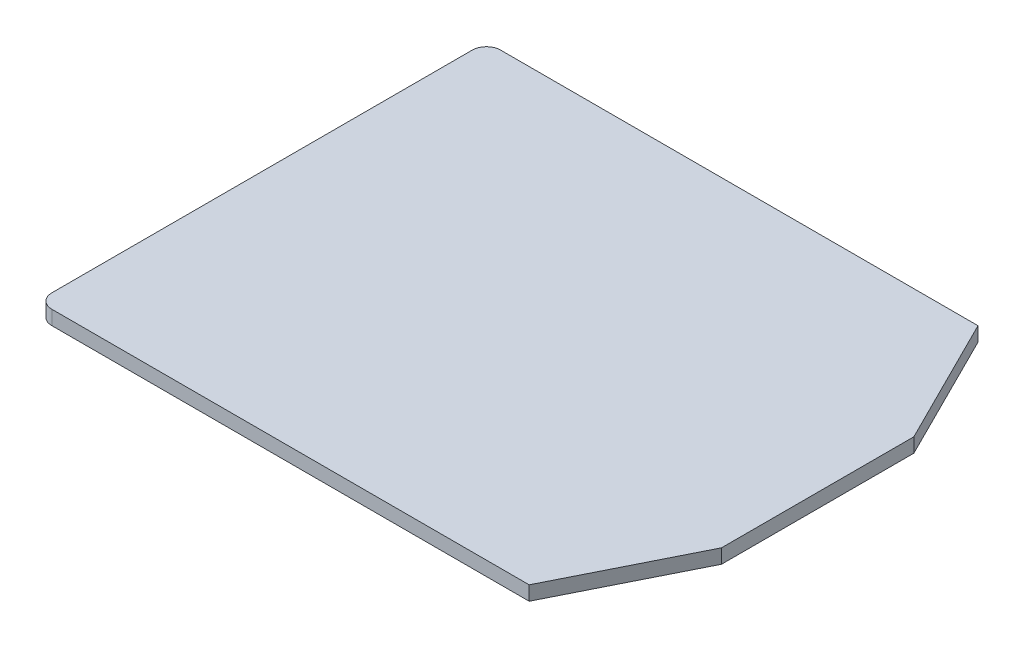
ISO-10303-21;
HEADER;
FILE_DESCRIPTION(('STEP AP214'),'2;1');
FILE_NAME('part.step','',(''),(''),'','','');
FILE_SCHEMA(('AUTOMOTIVE_DESIGN { 1 0 10303 214 1 1 1 1 }'));
ENDSEC;
DATA;
#1=APPLICATION_CONTEXT('core data for automotive mechanical design processes');
#2=APPLICATION_PROTOCOL_DEFINITION('international standard','automotive_design',2000,#1);
#3=PRODUCT_CONTEXT('',#1,'mechanical');
#4=PRODUCT('Part','Part','',(#3));
#5=PRODUCT_RELATED_PRODUCT_CATEGORY('part','',(#4));
#6=PRODUCT_DEFINITION_FORMATION('','',#4);
#7=PRODUCT_DEFINITION_CONTEXT('part definition',#1,'design');
#8=PRODUCT_DEFINITION('design','',#6,#7);
#9=PRODUCT_DEFINITION_SHAPE('','',#8);
#10=(LENGTH_UNIT() NAMED_UNIT(*) SI_UNIT(.MILLI.,.METRE.));
#11=(NAMED_UNIT(*) PLANE_ANGLE_UNIT() SI_UNIT($,.RADIAN.));
#12=(NAMED_UNIT(*) SI_UNIT($,.STERADIAN.) SOLID_ANGLE_UNIT());
#13=UNCERTAINTY_MEASURE_WITH_UNIT(LENGTH_MEASURE(1.E-05),#10,'distance_accuracy_value','');
#14=(GEOMETRIC_REPRESENTATION_CONTEXT(3) GLOBAL_UNCERTAINTY_ASSIGNED_CONTEXT((#13)) GLOBAL_UNIT_ASSIGNED_CONTEXT((#10,
#11,#12)) REPRESENTATION_CONTEXT('',''));
#15=CARTESIAN_POINT('',(0.,0.,0.));
#16=DIRECTION('',(0.,0.,1.));
#17=DIRECTION('',(1.,0.,0.));
#18=AXIS2_PLACEMENT_3D('',#15,#16,#17);
#19=CARTESIAN_POINT('',(0.,2.,0.));
#20=DIRECTION('',(1.,0.,0.));
#21=DIRECTION('',(0.,0.,-1.));
#22=AXIS2_PLACEMENT_3D('',#19,#20,#21);
#23=PLANE('',#22);
#24=DIRECTION('',(0.,0.,1.));
#25=VECTOR('',#24,1.);
#26=CARTESIAN_POINT('',(0.,2.,0.));
#27=LINE('',#26,#25);
#28=CARTESIAN_POINT('',(0.,2.,-61.));
#29=VERTEX_POINT('',#28);
#30=CARTESIAN_POINT('',(0.,2.,-2.));
#31=VERTEX_POINT('',#30);
#32=EDGE_CURVE('E110',#29,#31,#27,.T.);
#33=ORIENTED_EDGE('',*,*,#32,.F.);
#34=DIRECTION('',(0.,-1.,0.));
#35=VECTOR('',#34,1.);
#36=CARTESIAN_POINT('',(0.,2.,-61.));
#37=LINE('',#36,#35);
#38=CARTESIAN_POINT('',(0.,0.,-61.));
#39=VERTEX_POINT('',#38);
#40=EDGE_CURVE('E155',#29,#39,#37,.T.);
#41=ORIENTED_EDGE('',*,*,#40,.T.);
#42=DIRECTION('',(0.,0.,1.));
#43=VECTOR('',#42,1.);
#44=CARTESIAN_POINT('',(0.,0.,0.));
#45=LINE('',#44,#43);
#46=CARTESIAN_POINT('',(0.,0.,-2.));
#47=VERTEX_POINT('',#46);
#48=EDGE_CURVE('E135',#39,#47,#45,.T.);
#49=ORIENTED_EDGE('',*,*,#48,.T.);
#50=DIRECTION('',(0.,-1.,0.));
#51=VECTOR('',#50,1.);
#52=CARTESIAN_POINT('',(0.,2.,-2.));
#53=LINE('',#52,#51);
#54=EDGE_CURVE('E119',#47,#31,#53,.F.);
#55=ORIENTED_EDGE('',*,*,#54,.T.);
#56=EDGE_LOOP('',(#33,#41,#49,#55));
#57=FACE_BOUND('',#56,.T.);
#58=ADVANCED_FACE('F36',(#57),#23,.F.);
#59=CARTESIAN_POINT('',(63.,2.,0.));
#60=DIRECTION('',(0.,0.,-1.));
#61=DIRECTION('',(-1.,0.,0.));
#62=AXIS2_PLACEMENT_3D('',#59,#60,#61);
#63=PLANE('',#62);
#64=DIRECTION('',(1.,0.,0.));
#65=VECTOR('',#64,1.);
#66=CARTESIAN_POINT('',(0.,2.,0.));
#67=LINE('',#66,#65);
#68=CARTESIAN_POINT('',(2.,2.,0.));
#69=VERTEX_POINT('',#68);
#70=CARTESIAN_POINT('',(69.,2.,0.));
#71=VERTEX_POINT('',#70);
#72=EDGE_CURVE('E101',#69,#71,#67,.T.);
#73=ORIENTED_EDGE('',*,*,#72,.F.);
#74=DIRECTION('',(0.,-1.,0.));
#75=VECTOR('',#74,1.);
#76=CARTESIAN_POINT('',(2.,2.,0.));
#77=LINE('',#76,#75);
#78=CARTESIAN_POINT('',(2.,0.,0.));
#79=VERTEX_POINT('',#78);
#80=EDGE_CURVE('E166',#69,#79,#77,.T.);
#81=ORIENTED_EDGE('',*,*,#80,.T.);
#82=DIRECTION('',(1.,0.,0.));
#83=VECTOR('',#82,1.);
#84=CARTESIAN_POINT('',(63.,0.,0.));
#85=LINE('',#84,#83);
#86=CARTESIAN_POINT('',(69.,0.,0.));
#87=VERTEX_POINT('',#86);
#88=EDGE_CURVE('E116',#79,#87,#85,.T.);
#89=ORIENTED_EDGE('',*,*,#88,.T.);
#90=DIRECTION('',(0.,-1.,0.));
#91=VECTOR('',#90,1.);
#92=CARTESIAN_POINT('',(69.,2.,0.));
#93=LINE('',#92,#91);
#94=EDGE_CURVE('E113',#71,#87,#93,.T.);
#95=ORIENTED_EDGE('',*,*,#94,.F.);
#96=EDGE_LOOP('',(#73,#81,#89,#95));
#97=FACE_BOUND('',#96,.T.);
#98=ADVANCED_FACE('F114',(#97),#63,.F.);
#99=CARTESIAN_POINT('',(69.,2.,0.));
#100=DIRECTION('',(-0.894427190999916,0.,-0.447213595499957));
#101=DIRECTION('',(-0.447213595499957,0.,0.894427190999916));
#102=AXIS2_PLACEMENT_3D('',#99,#100,#101);
#103=PLANE('',#102);
#104=DIRECTION('',(0.447213595499957,0.,-0.894427190999916));
#105=VECTOR('',#104,1.);
#106=CARTESIAN_POINT('',(69.,0.,0.));
#107=LINE('',#106,#105);
#108=CARTESIAN_POINT('',(78.,0.,-18.));
#109=VERTEX_POINT('',#108);
#110=EDGE_CURVE('E139',#87,#109,#107,.T.);
#111=ORIENTED_EDGE('',*,*,#110,.T.);
#112=DIRECTION('',(0.,-1.,0.));
#113=VECTOR('',#112,1.);
#114=CARTESIAN_POINT('',(78.,2.,-18.));
#115=LINE('',#114,#113);
#116=CARTESIAN_POINT('',(78.,2.,-18.));
#117=VERTEX_POINT('',#116);
#118=EDGE_CURVE('E120',#117,#109,#115,.T.);
#119=ORIENTED_EDGE('',*,*,#118,.F.);
#120=DIRECTION('',(0.447213595499957,0.,-0.894427190999916));
#121=VECTOR('',#120,1.);
#122=CARTESIAN_POINT('',(69.,2.,0.));
#123=LINE('',#122,#121);
#124=EDGE_CURVE('E105',#71,#117,#123,.T.);
#125=ORIENTED_EDGE('',*,*,#124,.F.);
#126=ORIENTED_EDGE('',*,*,#94,.T.);
#127=EDGE_LOOP('',(#111,#119,#125,#126));
#128=FACE_BOUND('',#127,.T.);
#129=ADVANCED_FACE('F122',(#128),#103,.F.);
#130=CARTESIAN_POINT('',(78.,2.,-18.));
#131=DIRECTION('',(-1.,0.,0.));
#132=DIRECTION('',(0.,0.,1.));
#133=AXIS2_PLACEMENT_3D('',#130,#131,#132);
#134=PLANE('',#133);
#135=DIRECTION('',(0.,0.,-1.));
#136=VECTOR('',#135,1.);
#137=CARTESIAN_POINT('',(78.,0.,-18.));
#138=LINE('',#137,#136);
#139=CARTESIAN_POINT('',(78.,0.,-45.));
#140=VERTEX_POINT('',#139);
#141=EDGE_CURVE('E141',#109,#140,#138,.T.);
#142=ORIENTED_EDGE('',*,*,#141,.T.);
#143=DIRECTION('',(0.,-1.,0.));
#144=VECTOR('',#143,1.);
#145=CARTESIAN_POINT('',(78.,2.,-45.));
#146=LINE('',#145,#144);
#147=CARTESIAN_POINT('',(78.,2.,-45.));
#148=VERTEX_POINT('',#147);
#149=EDGE_CURVE('E150',#148,#140,#146,.T.);
#150=ORIENTED_EDGE('',*,*,#149,.F.);
#151=DIRECTION('',(0.,0.,-1.));
#152=VECTOR('',#151,1.);
#153=CARTESIAN_POINT('',(78.,2.,-18.));
#154=LINE('',#153,#152);
#155=EDGE_CURVE('E125',#117,#148,#154,.T.);
#156=ORIENTED_EDGE('',*,*,#155,.F.);
#157=ORIENTED_EDGE('',*,*,#118,.T.);
#158=EDGE_LOOP('',(#142,#150,#156,#157));
#159=FACE_BOUND('',#158,.T.);
#160=ADVANCED_FACE('F255',(#159),#134,.F.);
#161=CARTESIAN_POINT('',(78.,2.,-45.));
#162=DIRECTION('',(-0.894427190999916,0.,0.447213595499958));
#163=DIRECTION('',(0.447213595499958,0.,0.894427190999916));
#164=AXIS2_PLACEMENT_3D('',#161,#162,#163);
#165=PLANE('',#164);
#166=DIRECTION('',(-0.447213595499958,0.,-0.894427190999916));
#167=VECTOR('',#166,1.);
#168=CARTESIAN_POINT('',(78.,0.,-45.));
#169=LINE('',#168,#167);
#170=CARTESIAN_POINT('',(69.,0.,-63.));
#171=VERTEX_POINT('',#170);
#172=EDGE_CURVE('E143',#140,#171,#169,.T.);
#173=ORIENTED_EDGE('',*,*,#172,.T.);
#174=DIRECTION('',(0.,-1.,0.));
#175=VECTOR('',#174,1.);
#176=CARTESIAN_POINT('',(69.,2.,-63.));
#177=LINE('',#176,#175);
#178=CARTESIAN_POINT('',(69.,2.,-63.));
#179=VERTEX_POINT('',#178);
#180=EDGE_CURVE('E134',#179,#171,#177,.T.);
#181=ORIENTED_EDGE('',*,*,#180,.F.);
#182=DIRECTION('',(-0.447213595499958,0.,-0.894427190999916));
#183=VECTOR('',#182,1.);
#184=CARTESIAN_POINT('',(78.,2.,-45.));
#185=LINE('',#184,#183);
#186=EDGE_CURVE('E127',#148,#179,#185,.T.);
#187=ORIENTED_EDGE('',*,*,#186,.F.);
#188=ORIENTED_EDGE('',*,*,#149,.T.);
#189=EDGE_LOOP('',(#173,#181,#187,#188));
#190=FACE_BOUND('',#189,.T.);
#191=ADVANCED_FACE('F261',(#190),#165,.F.);
#192=CARTESIAN_POINT('',(0.,2.,-63.));
#193=DIRECTION('',(0.,0.,1.));
#194=DIRECTION('',(1.,0.,0.));
#195=AXIS2_PLACEMENT_3D('',#192,#193,#194);
#196=PLANE('',#195);
#197=DIRECTION('',(-1.,0.,0.));
#198=VECTOR('',#197,1.);
#199=CARTESIAN_POINT('',(0.,0.,-63.));
#200=LINE('',#199,#198);
#201=CARTESIAN_POINT('',(2.,0.,-63.));
#202=VERTEX_POINT('',#201);
#203=EDGE_CURVE('E146',#171,#202,#200,.T.);
#204=ORIENTED_EDGE('',*,*,#203,.T.);
#205=DIRECTION('',(0.,-1.,0.));
#206=VECTOR('',#205,1.);
#207=CARTESIAN_POINT('',(2.,2.,-63.));
#208=LINE('',#207,#206);
#209=CARTESIAN_POINT('',(2.,2.,-63.));
#210=VERTEX_POINT('',#209);
#211=EDGE_CURVE('E59',#202,#210,#208,.F.);
#212=ORIENTED_EDGE('',*,*,#211,.T.);
#213=DIRECTION('',(-1.,0.,0.));
#214=VECTOR('',#213,1.);
#215=CARTESIAN_POINT('',(69.,2.,-63.));
#216=LINE('',#215,#214);
#217=EDGE_CURVE('E132',#179,#210,#216,.T.);
#218=ORIENTED_EDGE('',*,*,#217,.F.);
#219=ORIENTED_EDGE('',*,*,#180,.T.);
#220=EDGE_LOOP('',(#204,#212,#218,#219));
#221=FACE_BOUND('',#220,.T.);
#222=ADVANCED_FACE('F262',(#221),#196,.F.);
#223=CARTESIAN_POINT('',(0.,2.,0.));
#224=DIRECTION('',(0.,-1.,0.));
#225=DIRECTION('',(0.,0.,-1.));
#226=AXIS2_PLACEMENT_3D('',#223,#224,#225);
#227=PLANE('',#226);
#228=ORIENTED_EDGE('',*,*,#217,.T.);
#229=CARTESIAN_POINT('',(2.,2.,-61.));
#230=DIRECTION('',(0.,-1.,0.));
#231=DIRECTION('',(0.,0.,-1.));
#232=AXIS2_PLACEMENT_3D('',#229,#230,#231);
#233=CIRCLE('',#232,2.);
#234=EDGE_CURVE('E164',#210,#29,#233,.F.);
#235=ORIENTED_EDGE('',*,*,#234,.T.);
#236=ORIENTED_EDGE('',*,*,#32,.T.);
#237=CARTESIAN_POINT('',(2.,2.,-2.));
#238=DIRECTION('',(0.,-1.,0.));
#239=DIRECTION('',(0.,0.,-1.));
#240=AXIS2_PLACEMENT_3D('',#237,#238,#239);
#241=CIRCLE('',#240,2.);
#242=EDGE_CURVE('E51',#31,#69,#241,.F.);
#243=ORIENTED_EDGE('',*,*,#242,.T.);
#244=ORIENTED_EDGE('',*,*,#72,.T.);
#245=ORIENTED_EDGE('',*,*,#124,.T.);
#246=ORIENTED_EDGE('',*,*,#155,.T.);
#247=ORIENTED_EDGE('',*,*,#186,.T.);
#248=EDGE_LOOP('',(#228,#235,#236,#243,#244,#245,#246,#247));
#249=FACE_BOUND('',#248,.T.);
#250=ADVANCED_FACE('F103',(#249),#227,.F.);
#251=CARTESIAN_POINT('',(0.,0.,0.));
#252=DIRECTION('',(0.,-1.,0.));
#253=DIRECTION('',(0.,0.,-1.));
#254=AXIS2_PLACEMENT_3D('',#251,#252,#253);
#255=PLANE('',#254);
#256=CARTESIAN_POINT('',(58.,0.,-31.5));
#257=DIRECTION('',(0.,-1.,0.));
#258=DIRECTION('',(0.,0.,-1.));
#259=AXIS2_PLACEMENT_3D('',#256,#257,#258);
#260=CIRCLE('',#259,3.);
#261=CARTESIAN_POINT('',(58.,0.,-34.5));
#262=VERTEX_POINT('',#261);
#263=EDGE_CURVE('E174',#262,#262,#260,.T.);
#264=ORIENTED_EDGE('',*,*,#263,.F.);
#265=EDGE_LOOP('',(#264));
#266=FACE_BOUND('',#265,.T.);
#267=CARTESIAN_POINT('',(20.,0.,-15.75));
#268=DIRECTION('',(0.,-1.,0.));
#269=DIRECTION('',(0.,0.,-1.));
#270=AXIS2_PLACEMENT_3D('',#267,#268,#269);
#271=CIRCLE('',#270,3.);
#272=CARTESIAN_POINT('',(20.,0.,-18.75));
#273=VERTEX_POINT('',#272);
#274=EDGE_CURVE('E171',#273,#273,#271,.T.);
#275=ORIENTED_EDGE('',*,*,#274,.F.);
#276=EDGE_LOOP('',(#275));
#277=FACE_BOUND('',#276,.T.);
#278=CARTESIAN_POINT('',(20.,0.,-47.25));
#279=DIRECTION('',(0.,-1.,0.));
#280=DIRECTION('',(0.,0.,-1.));
#281=AXIS2_PLACEMENT_3D('',#278,#279,#280);
#282=CIRCLE('',#281,3.);
#283=CARTESIAN_POINT('',(20.,0.,-50.25));
#284=VERTEX_POINT('',#283);
#285=EDGE_CURVE('E168',#284,#284,#282,.T.);
#286=ORIENTED_EDGE('',*,*,#285,.F.);
#287=EDGE_LOOP('',(#286));
#288=FACE_BOUND('',#287,.T.);
#289=ORIENTED_EDGE('',*,*,#48,.F.);
#290=CARTESIAN_POINT('',(2.,0.,-61.));
#291=DIRECTION('',(0.,-1.,0.));
#292=DIRECTION('',(0.,0.,-1.));
#293=AXIS2_PLACEMENT_3D('',#290,#291,#292);
#294=CIRCLE('',#293,2.);
#295=EDGE_CURVE('E160',#39,#202,#294,.T.);
#296=ORIENTED_EDGE('',*,*,#295,.T.);
#297=ORIENTED_EDGE('',*,*,#203,.F.);
#298=ORIENTED_EDGE('',*,*,#172,.F.);
#299=ORIENTED_EDGE('',*,*,#141,.F.);
#300=ORIENTED_EDGE('',*,*,#110,.F.);
#301=ORIENTED_EDGE('',*,*,#88,.F.);
#302=CARTESIAN_POINT('',(2.,0.,-2.));
#303=DIRECTION('',(0.,-1.,0.));
#304=DIRECTION('',(0.,0.,-1.));
#305=AXIS2_PLACEMENT_3D('',#302,#303,#304);
#306=CIRCLE('',#305,2.);
#307=EDGE_CURVE('E158',#79,#47,#306,.T.);
#308=ORIENTED_EDGE('',*,*,#307,.T.);
#309=EDGE_LOOP('',(#289,#296,#297,#298,#299,#300,#301,#308));
#310=FACE_BOUND('',#309,.T.);
#311=ADVANCED_FACE('F217',(#266,#277,#288,#310),#255,.T.);
#312=CARTESIAN_POINT('',(2.,2.,-61.));
#313=DIRECTION('',(0.,-1.,0.));
#314=DIRECTION('',(0.,0.,-1.));
#315=AXIS2_PLACEMENT_3D('',#312,#313,#314);
#316=CYLINDRICAL_SURFACE('',#315,2.);
#317=ORIENTED_EDGE('',*,*,#234,.F.);
#318=ORIENTED_EDGE('',*,*,#211,.F.);
#319=ORIENTED_EDGE('',*,*,#295,.F.);
#320=ORIENTED_EDGE('',*,*,#40,.F.);
#321=EDGE_LOOP('',(#317,#318,#319,#320));
#322=FACE_BOUND('',#321,.T.);
#323=ADVANCED_FACE('F213',(#322),#316,.T.);
#324=CARTESIAN_POINT('',(2.,2.,-2.));
#325=DIRECTION('',(0.,-1.,0.));
#326=DIRECTION('',(0.,0.,-1.));
#327=AXIS2_PLACEMENT_3D('',#324,#325,#326);
#328=CYLINDRICAL_SURFACE('',#327,2.);
#329=ORIENTED_EDGE('',*,*,#242,.F.);
#330=ORIENTED_EDGE('',*,*,#54,.F.);
#331=ORIENTED_EDGE('',*,*,#307,.F.);
#332=ORIENTED_EDGE('',*,*,#80,.F.);
#333=EDGE_LOOP('',(#329,#330,#331,#332));
#334=FACE_BOUND('',#333,.T.);
#335=ADVANCED_FACE('F216',(#334),#328,.T.);
#336=CARTESIAN_POINT('',(20.,-5.,-47.25));
#337=DIRECTION('',(0.,1.,0.));
#338=DIRECTION('',(0.,0.,1.));
#339=AXIS2_PLACEMENT_3D('',#336,#337,#338);
#340=CYLINDRICAL_SURFACE('',#339,3.);
#341=CARTESIAN_POINT('',(20.,-3.,-47.25));
#342=DIRECTION('',(0.,1.,0.));
#343=DIRECTION('',(0.,0.,1.));
#344=AXIS2_PLACEMENT_3D('',#341,#342,#343);
#345=CIRCLE('',#344,3.);
#346=CARTESIAN_POINT('',(20.,-3.,-44.25));
#347=VERTEX_POINT('',#346);
#348=EDGE_CURVE('E183',#347,#347,#345,.T.);
#349=ORIENTED_EDGE('',*,*,#348,.T.);
#350=EDGE_LOOP('',(#349));
#351=FACE_BOUND('',#350,.T.);
#352=ORIENTED_EDGE('',*,*,#285,.T.);
#353=EDGE_LOOP('',(#352));
#354=FACE_BOUND('',#353,.T.);
#355=ADVANCED_FACE('F221',(#351,#354),#340,.T.);
#356=CARTESIAN_POINT('',(20.,-5.,-47.25));
#357=DIRECTION('',(0.,1.,0.));
#358=DIRECTION('',(0.,0.,1.));
#359=AXIS2_PLACEMENT_3D('',#356,#357,#358);
#360=PLANE('',#359);
#361=CARTESIAN_POINT('',(20.,-5.,-47.25));
#362=DIRECTION('',(0.,1.,0.));
#363=DIRECTION('',(0.,0.,1.));
#364=AXIS2_PLACEMENT_3D('',#361,#362,#363);
#365=CIRCLE('',#364,0.999999999999998);
#366=CARTESIAN_POINT('',(20.,-5.,-46.25));
#367=VERTEX_POINT('',#366);
#368=EDGE_CURVE('E186',#367,#367,#365,.F.);
#369=ORIENTED_EDGE('',*,*,#368,.T.);
#370=EDGE_LOOP('',(#369));
#371=FACE_BOUND('',#370,.T.);
#372=ADVANCED_FACE('F333',(#371),#360,.F.);
#373=CARTESIAN_POINT('',(20.,-5.,-15.75));
#374=DIRECTION('',(0.,1.,0.));
#375=DIRECTION('',(0.,0.,1.));
#376=AXIS2_PLACEMENT_3D('',#373,#374,#375);
#377=CYLINDRICAL_SURFACE('',#376,3.);
#378=CARTESIAN_POINT('',(20.,-3.,-15.75));
#379=DIRECTION('',(0.,1.,0.));
#380=DIRECTION('',(0.,0.,1.));
#381=AXIS2_PLACEMENT_3D('',#378,#379,#380);
#382=CIRCLE('',#381,3.);
#383=CARTESIAN_POINT('',(20.,-3.,-12.75));
#384=VERTEX_POINT('',#383);
#385=EDGE_CURVE('E44',#384,#384,#382,.T.);
#386=ORIENTED_EDGE('',*,*,#385,.T.);
#387=EDGE_LOOP('',(#386));
#388=FACE_BOUND('',#387,.T.);
#389=ORIENTED_EDGE('',*,*,#274,.T.);
#390=EDGE_LOOP('',(#389));
#391=FACE_BOUND('',#390,.T.);
#392=ADVANCED_FACE('F191',(#388,#391),#377,.T.);
#393=CARTESIAN_POINT('',(20.,-5.,-15.75));
#394=DIRECTION('',(0.,1.,0.));
#395=DIRECTION('',(0.,0.,1.));
#396=AXIS2_PLACEMENT_3D('',#393,#394,#395);
#397=PLANE('',#396);
#398=CARTESIAN_POINT('',(20.,-5.,-15.75));
#399=DIRECTION('',(0.,1.,0.));
#400=DIRECTION('',(0.,0.,1.));
#401=AXIS2_PLACEMENT_3D('',#398,#399,#400);
#402=CIRCLE('',#401,0.999999999999997);
#403=CARTESIAN_POINT('',(20.,-5.,-14.75));
#404=VERTEX_POINT('',#403);
#405=EDGE_CURVE('E11',#404,#404,#402,.F.);
#406=ORIENTED_EDGE('',*,*,#405,.T.);
#407=EDGE_LOOP('',(#406));
#408=FACE_BOUND('',#407,.T.);
#409=ADVANCED_FACE('F238',(#408),#397,.F.);
#410=CARTESIAN_POINT('',(58.,-5.,-31.5));
#411=DIRECTION('',(0.,1.,0.));
#412=DIRECTION('',(0.,0.,1.));
#413=AXIS2_PLACEMENT_3D('',#410,#411,#412);
#414=CYLINDRICAL_SURFACE('',#413,3.);
#415=CARTESIAN_POINT('',(58.,-3.,-31.5));
#416=DIRECTION('',(0.,1.,0.));
#417=DIRECTION('',(0.,0.,1.));
#418=AXIS2_PLACEMENT_3D('',#415,#416,#417);
#419=CIRCLE('',#418,3.);
#420=CARTESIAN_POINT('',(58.,-3.,-28.5));
#421=VERTEX_POINT('',#420);
#422=EDGE_CURVE('E177',#421,#421,#419,.T.);
#423=ORIENTED_EDGE('',*,*,#422,.T.);
#424=EDGE_LOOP('',(#423));
#425=FACE_BOUND('',#424,.T.);
#426=ORIENTED_EDGE('',*,*,#263,.T.);
#427=EDGE_LOOP('',(#426));
#428=FACE_BOUND('',#427,.T.);
#429=ADVANCED_FACE('F229',(#425,#428),#414,.T.);
#430=CARTESIAN_POINT('',(58.,-5.,-31.5));
#431=DIRECTION('',(0.,1.,0.));
#432=DIRECTION('',(0.,0.,1.));
#433=AXIS2_PLACEMENT_3D('',#430,#431,#432);
#434=PLANE('',#433);
#435=CARTESIAN_POINT('',(58.,-5.,-31.5));
#436=DIRECTION('',(0.,1.,0.));
#437=DIRECTION('',(0.,0.,1.));
#438=AXIS2_PLACEMENT_3D('',#435,#436,#437);
#439=CIRCLE('',#438,1.);
#440=CARTESIAN_POINT('',(58.,-5.,-30.5));
#441=VERTEX_POINT('',#440);
#442=EDGE_CURVE('E180',#441,#441,#439,.F.);
#443=ORIENTED_EDGE('',*,*,#442,.T.);
#444=EDGE_LOOP('',(#443));
#445=FACE_BOUND('',#444,.T.);
#446=ADVANCED_FACE('F224',(#445),#434,.F.);
#447=CARTESIAN_POINT('',(58.,-3.,-31.5));
#448=DIRECTION('',(0.,1.,0.));
#449=DIRECTION('',(0.,0.,1.));
#450=AXIS2_PLACEMENT_3D('',#447,#448,#449);
#451=DEGENERATE_TOROIDAL_SURFACE('',#450,1.,2.,.T.);
#452=ORIENTED_EDGE('',*,*,#442,.F.);
#453=EDGE_LOOP('',(#452));
#454=FACE_BOUND('',#453,.T.);
#455=ORIENTED_EDGE('',*,*,#422,.F.);
#456=EDGE_LOOP('',(#455));
#457=FACE_BOUND('',#456,.T.);
#458=ADVANCED_FACE('F200',(#454,#457),#451,.T.);
#459=CARTESIAN_POINT('',(20.,-3.,-47.25));
#460=DIRECTION('',(0.,1.,0.));
#461=DIRECTION('',(0.,0.,1.));
#462=AXIS2_PLACEMENT_3D('',#459,#460,#461);
#463=DEGENERATE_TOROIDAL_SURFACE('',#462,0.999999999999998,2.,.T.);
#464=ORIENTED_EDGE('',*,*,#368,.F.);
#465=EDGE_LOOP('',(#464));
#466=FACE_BOUND('',#465,.T.);
#467=ORIENTED_EDGE('',*,*,#348,.F.);
#468=EDGE_LOOP('',(#467));
#469=FACE_BOUND('',#468,.T.);
#470=ADVANCED_FACE('F195',(#466,#469),#463,.T.);
#471=CARTESIAN_POINT('',(20.,-3.,-15.75));
#472=DIRECTION('',(0.,1.,0.));
#473=DIRECTION('',(0.,0.,1.));
#474=AXIS2_PLACEMENT_3D('',#471,#472,#473);
#475=DEGENERATE_TOROIDAL_SURFACE('',#474,0.999999999999997,2.,.T.);
#476=ORIENTED_EDGE('',*,*,#405,.F.);
#477=EDGE_LOOP('',(#476));
#478=FACE_BOUND('',#477,.T.);
#479=ORIENTED_EDGE('',*,*,#385,.F.);
#480=EDGE_LOOP('',(#479));
#481=FACE_BOUND('',#480,.T.);
#482=ADVANCED_FACE('F38',(#478,#481),#475,.T.);
#483=CLOSED_SHELL('',(#58,#98,#129,#160,#191,#222,#250,#311,#323,#335,#355,#372,#392,#409,#429,
#446,#458,#470,#482));
#484=MANIFOLD_SOLID_BREP('B2',#483);
#485=ADVANCED_BREP_SHAPE_REPRESENTATION('',(#18,#484),#14);
#486=SHAPE_DEFINITION_REPRESENTATION(#9,#485);
ENDSEC;
END-ISO-10303-21;
